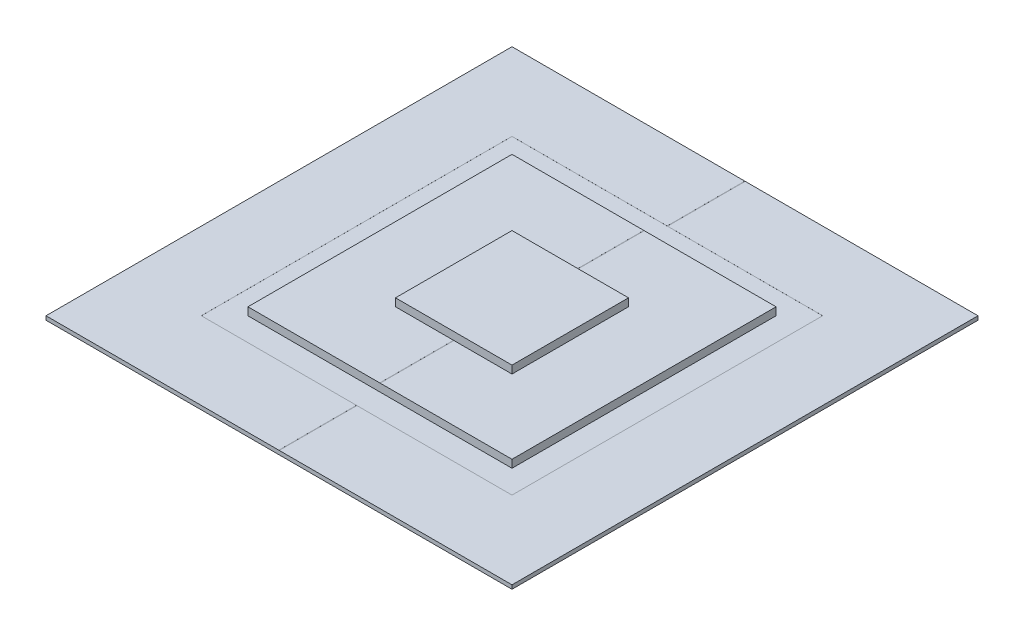
ISO-10303-21;
HEADER;
FILE_DESCRIPTION(('STEP AP214'),'2;1');
FILE_NAME('part.step','',(''),(''),'','','');
FILE_SCHEMA(('AUTOMOTIVE_DESIGN { 1 0 10303 214 1 1 1 1 }'));
ENDSEC;
DATA;
#1=APPLICATION_CONTEXT('core data for automotive mechanical design processes');
#2=APPLICATION_PROTOCOL_DEFINITION('international standard','automotive_design',2000,#1);
#3=PRODUCT_CONTEXT('',#1,'mechanical');
#4=PRODUCT('Part','Part','',(#3));
#5=PRODUCT_RELATED_PRODUCT_CATEGORY('part','',(#4));
#6=PRODUCT_DEFINITION_FORMATION('','',#4);
#7=PRODUCT_DEFINITION_CONTEXT('part definition',#1,'design');
#8=PRODUCT_DEFINITION('design','',#6,#7);
#9=PRODUCT_DEFINITION_SHAPE('','',#8);
#10=(LENGTH_UNIT() NAMED_UNIT(*) SI_UNIT(.MILLI.,.METRE.));
#11=(NAMED_UNIT(*) PLANE_ANGLE_UNIT() SI_UNIT($,.RADIAN.));
#12=(NAMED_UNIT(*) SI_UNIT($,.STERADIAN.) SOLID_ANGLE_UNIT());
#13=UNCERTAINTY_MEASURE_WITH_UNIT(LENGTH_MEASURE(1.E-05),#10,'distance_accuracy_value','');
#14=(GEOMETRIC_REPRESENTATION_CONTEXT(3) GLOBAL_UNCERTAINTY_ASSIGNED_CONTEXT((#13)) GLOBAL_UNIT_ASSIGNED_CONTEXT((#10,
#11,#12)) REPRESENTATION_CONTEXT('',''));
#15=CARTESIAN_POINT('',(0.,0.,0.));
#16=DIRECTION('',(0.,0.,1.));
#17=DIRECTION('',(1.,0.,0.));
#18=AXIS2_PLACEMENT_3D('',#15,#16,#17);
#19=CARTESIAN_POINT('',(0.,300.,0.));
#20=DIRECTION('',(0.,1.,0.));
#21=DIRECTION('',(0.,0.,1.));
#22=AXIS2_PLACEMENT_3D('',#19,#20,#21);
#23=PLANE('',#22);
#24=DIRECTION('',(0.,0.,1.));
#25=VECTOR('',#24,1.);
#26=CARTESIAN_POINT('',(4500.,300.,4500.));
#27=LINE('',#26,#25);
#28=CARTESIAN_POINT('',(4500.,300.,4500.));
#29=VERTEX_POINT('',#28);
#30=CARTESIAN_POINT('',(4500.,300.,7500.));
#31=VERTEX_POINT('',#30);
#32=EDGE_CURVE('E940',#29,#31,#27,.T.);
#33=ORIENTED_EDGE('',*,*,#32,.F.);
#34=DIRECTION('',(-1.,0.,0.));
#35=VECTOR('',#34,1.);
#36=CARTESIAN_POINT('',(7500.,300.,4500.));
#37=LINE('',#36,#35);
#38=CARTESIAN_POINT('',(5995.,300.,4500.));
#39=VERTEX_POINT('',#38);
#40=EDGE_CURVE('E291',#39,#29,#37,.T.);
#41=ORIENTED_EDGE('',*,*,#40,.F.);
#42=DIRECTION('',(0.,0.,-1.));
#43=VECTOR('',#42,1.);
#44=CARTESIAN_POINT('',(5995.,300.,2600.));
#45=LINE('',#44,#43);
#46=CARTESIAN_POINT('',(5995.,300.,2600.));
#47=VERTEX_POINT('',#46);
#48=EDGE_CURVE('E337',#39,#47,#45,.T.);
#49=ORIENTED_EDGE('',*,*,#48,.T.);
#50=DIRECTION('',(-1.,0.,0.));
#51=VECTOR('',#50,1.);
#52=CARTESIAN_POINT('',(2600.,300.,2600.));
#53=LINE('',#52,#51);
#54=CARTESIAN_POINT('',(2600.,300.,2600.));
#55=VERTEX_POINT('',#54);
#56=EDGE_CURVE('E342',#47,#55,#53,.T.);
#57=ORIENTED_EDGE('',*,*,#56,.T.);
#58=DIRECTION('',(0.,0.,1.));
#59=VECTOR('',#58,1.);
#60=CARTESIAN_POINT('',(2600.,300.,2600.));
#61=LINE('',#60,#59);
#62=CARTESIAN_POINT('',(2600.,300.,9400.));
#63=VERTEX_POINT('',#62);
#64=EDGE_CURVE('E329',#55,#63,#61,.T.);
#65=ORIENTED_EDGE('',*,*,#64,.T.);
#66=DIRECTION('',(1.,0.,0.));
#67=VECTOR('',#66,1.);
#68=CARTESIAN_POINT('',(2600.,300.,9400.));
#69=LINE('',#68,#67);
#70=CARTESIAN_POINT('',(5995.,300.,9400.));
#71=VERTEX_POINT('',#70);
#72=EDGE_CURVE('E333',#63,#71,#69,.T.);
#73=ORIENTED_EDGE('',*,*,#72,.T.);
#74=CARTESIAN_POINT('',(5995.,300.,7500.));
#75=VERTEX_POINT('',#74);
#76=EDGE_CURVE('E338',#71,#75,#45,.T.);
#77=ORIENTED_EDGE('',*,*,#76,.T.);
#78=DIRECTION('',(1.,0.,0.));
#79=VECTOR('',#78,1.);
#80=CARTESIAN_POINT('',(4500.,300.,7500.));
#81=LINE('',#80,#79);
#82=EDGE_CURVE('E933',#31,#75,#81,.T.);
#83=ORIENTED_EDGE('',*,*,#82,.F.);
#84=EDGE_LOOP('',(#33,#41,#49,#57,#65,#73,#77,#83));
#85=FACE_BOUND('',#84,.T.);
#86=ADVANCED_FACE('F67',(#85),#23,.T.);
#87=CARTESIAN_POINT('',(0.,300.,0.));
#88=DIRECTION('',(0.,1.,0.));
#89=DIRECTION('',(0.,0.,1.));
#90=AXIS2_PLACEMENT_3D('',#87,#88,#89);
#91=PLANE('',#90);
#92=DIRECTION('',(0.,0.,1.));
#93=VECTOR('',#92,1.);
#94=CARTESIAN_POINT('',(6005.,300.,2600.));
#95=LINE('',#94,#93);
#96=CARTESIAN_POINT('',(6005.,300.,2600.));
#97=VERTEX_POINT('',#96);
#98=CARTESIAN_POINT('',(6005.,300.,4500.));
#99=VERTEX_POINT('',#98);
#100=EDGE_CURVE('E312',#97,#99,#95,.T.);
#101=ORIENTED_EDGE('',*,*,#100,.T.);
#102=CARTESIAN_POINT('',(7500.,300.,4500.));
#103=VERTEX_POINT('',#102);
#104=EDGE_CURVE('E935',#103,#99,#37,.T.);
#105=ORIENTED_EDGE('',*,*,#104,.F.);
#106=DIRECTION('',(0.,0.,-1.));
#107=VECTOR('',#106,1.);
#108=CARTESIAN_POINT('',(7500.,300.,7500.));
#109=LINE('',#108,#107);
#110=CARTESIAN_POINT('',(7500.,300.,7500.));
#111=VERTEX_POINT('',#110);
#112=EDGE_CURVE('E285',#111,#103,#109,.T.);
#113=ORIENTED_EDGE('',*,*,#112,.F.);
#114=DIRECTION('',(-1.,0.,0.));
#115=VECTOR('',#114,1.);
#116=CARTESIAN_POINT('',(0.,300.,7500.));
#117=LINE('',#116,#115);
#118=CARTESIAN_POINT('',(6005.,300.,7500.));
#119=VERTEX_POINT('',#118);
#120=EDGE_CURVE('E12',#111,#119,#117,.T.);
#121=ORIENTED_EDGE('',*,*,#120,.T.);
#122=CARTESIAN_POINT('',(6005.,300.,9400.));
#123=VERTEX_POINT('',#122);
#124=EDGE_CURVE('E311',#119,#123,#95,.T.);
#125=ORIENTED_EDGE('',*,*,#124,.T.);
#126=DIRECTION('',(1.,0.,0.));
#127=VECTOR('',#126,1.);
#128=CARTESIAN_POINT('',(6005.,300.,9400.));
#129=LINE('',#128,#127);
#130=CARTESIAN_POINT('',(9400.,300.,9400.));
#131=VERTEX_POINT('',#130);
#132=EDGE_CURVE('E316',#123,#131,#129,.T.);
#133=ORIENTED_EDGE('',*,*,#132,.T.);
#134=DIRECTION('',(0.,0.,-1.));
#135=VECTOR('',#134,1.);
#136=CARTESIAN_POINT('',(9400.,300.,2600.));
#137=LINE('',#136,#135);
#138=CARTESIAN_POINT('',(9400.,300.,2600.));
#139=VERTEX_POINT('',#138);
#140=EDGE_CURVE('E321',#131,#139,#137,.T.);
#141=ORIENTED_EDGE('',*,*,#140,.T.);
#142=DIRECTION('',(-1.,0.,0.));
#143=VECTOR('',#142,1.);
#144=CARTESIAN_POINT('',(6005.,300.,2600.));
#145=LINE('',#144,#143);
#146=EDGE_CURVE('E325',#139,#97,#145,.T.);
#147=ORIENTED_EDGE('',*,*,#146,.T.);
#148=EDGE_LOOP('',(#101,#105,#113,#121,#125,#133,#141,#147));
#149=FACE_BOUND('',#148,.T.);
#150=ADVANCED_FACE('F574',(#149),#91,.T.);
#151=CARTESIAN_POINT('',(6005.,99.5,0.));
#152=DIRECTION('',(1.,0.,0.));
#153=DIRECTION('',(0.,0.,-1.));
#154=AXIS2_PLACEMENT_3D('',#151,#152,#153);
#155=PLANE('',#154);
#156=DIRECTION('',(0.,0.,-1.));
#157=VECTOR('',#156,1.);
#158=CARTESIAN_POINT('',(6005.,299.5,2600.));
#159=LINE('',#158,#157);
#160=CARTESIAN_POINT('',(6005.,299.5,9400.));
#161=VERTEX_POINT('',#160);
#162=CARTESIAN_POINT('',(6005.,299.5,2600.));
#163=VERTEX_POINT('',#162);
#164=EDGE_CURVE('E305',#161,#163,#159,.T.);
#165=ORIENTED_EDGE('',*,*,#164,.F.);
#166=DIRECTION('',(0.,-1.,0.));
#167=VECTOR('',#166,1.);
#168=CARTESIAN_POINT('',(6005.,100.,9400.));
#169=LINE('',#168,#167);
#170=EDGE_CURVE('E399',#123,#161,#169,.T.);
#171=ORIENTED_EDGE('',*,*,#170,.F.);
#172=ORIENTED_EDGE('',*,*,#124,.F.);
#173=EDGE_CURVE('E317',#99,#119,#95,.T.);
#174=ORIENTED_EDGE('',*,*,#173,.F.);
#175=ORIENTED_EDGE('',*,*,#100,.F.);
#176=DIRECTION('',(0.,1.,0.));
#177=VECTOR('',#176,1.);
#178=CARTESIAN_POINT('',(6005.,100.,2600.));
#179=LINE('',#178,#177);
#180=EDGE_CURVE('E403',#163,#97,#179,.T.);
#181=ORIENTED_EDGE('',*,*,#180,.F.);
#182=EDGE_LOOP('',(#165,#171,#172,#174,#175,#181));
#183=FACE_BOUND('',#182,.T.);
#184=ADVANCED_FACE('F581',(#183),#155,.F.);
#185=CARTESIAN_POINT('',(5995.,99.5,0.));
#186=DIRECTION('',(-1.,0.,0.));
#187=DIRECTION('',(0.,0.,1.));
#188=AXIS2_PLACEMENT_3D('',#185,#186,#187);
#189=PLANE('',#188);
#190=DIRECTION('',(0.,0.,1.));
#191=VECTOR('',#190,1.);
#192=CARTESIAN_POINT('',(5995.,299.5,9400.));
#193=LINE('',#192,#191);
#194=CARTESIAN_POINT('',(5995.,299.5,2600.));
#195=VERTEX_POINT('',#194);
#196=CARTESIAN_POINT('',(5995.,299.5,9400.));
#197=VERTEX_POINT('',#196);
#198=EDGE_CURVE('E293',#195,#197,#193,.T.);
#199=ORIENTED_EDGE('',*,*,#198,.F.);
#200=DIRECTION('',(0.,-1.,0.));
#201=VECTOR('',#200,1.);
#202=CARTESIAN_POINT('',(5995.,100.,2600.));
#203=LINE('',#202,#201);
#204=EDGE_CURVE('E389',#47,#195,#203,.T.);
#205=ORIENTED_EDGE('',*,*,#204,.F.);
#206=ORIENTED_EDGE('',*,*,#48,.F.);
#207=EDGE_CURVE('E343',#75,#39,#45,.T.);
#208=ORIENTED_EDGE('',*,*,#207,.F.);
#209=ORIENTED_EDGE('',*,*,#76,.F.);
#210=DIRECTION('',(0.,1.,0.));
#211=VECTOR('',#210,1.);
#212=CARTESIAN_POINT('',(5995.,100.,9400.));
#213=LINE('',#212,#211);
#214=EDGE_CURVE('E377',#197,#71,#213,.T.);
#215=ORIENTED_EDGE('',*,*,#214,.F.);
#216=EDGE_LOOP('',(#199,#205,#206,#208,#209,#215));
#217=FACE_BOUND('',#216,.T.);
#218=ADVANCED_FACE('F604',(#217),#189,.F.);
#219=CARTESIAN_POINT('',(0.,100.,0.));
#220=DIRECTION('',(0.,1.,0.));
#221=DIRECTION('',(0.,0.,1.));
#222=AXIS2_PLACEMENT_3D('',#219,#220,#221);
#223=PLANE('',#222);
#224=DIRECTION('',(0.,0.,-1.));
#225=VECTOR('',#224,1.);
#226=CARTESIAN_POINT('',(6005.,100.,0.));
#227=LINE('',#226,#225);
#228=CARTESIAN_POINT('',(6005.,100.,12000.));
#229=VERTEX_POINT('',#228);
#230=CARTESIAN_POINT('',(6005.,100.,10000.));
#231=VERTEX_POINT('',#230);
#232=EDGE_CURVE('E353',#229,#231,#227,.T.);
#233=ORIENTED_EDGE('',*,*,#232,.F.);
#234=DIRECTION('',(1.,0.,0.));
#235=VECTOR('',#234,1.);
#236=CARTESIAN_POINT('',(0.,100.,12000.));
#237=LINE('',#236,#235);
#238=CARTESIAN_POINT('',(12000.,100.,12000.));
#239=VERTEX_POINT('',#238);
#240=EDGE_CURVE('E494',#229,#239,#237,.T.);
#241=ORIENTED_EDGE('',*,*,#240,.T.);
#242=DIRECTION('',(0.,0.,-1.));
#243=VECTOR('',#242,1.);
#244=CARTESIAN_POINT('',(12000.,100.,0.));
#245=LINE('',#244,#243);
#246=CARTESIAN_POINT('',(12000.,100.,0.));
#247=VERTEX_POINT('',#246);
#248=EDGE_CURVE('E482',#239,#247,#245,.T.);
#249=ORIENTED_EDGE('',*,*,#248,.T.);
#250=DIRECTION('',(-1.,0.,0.));
#251=VECTOR('',#250,1.);
#252=CARTESIAN_POINT('',(0.,100.,0.));
#253=LINE('',#252,#251);
#254=CARTESIAN_POINT('',(6005.,100.,0.));
#255=VERTEX_POINT('',#254);
#256=EDGE_CURVE('E487',#247,#255,#253,.T.);
#257=ORIENTED_EDGE('',*,*,#256,.T.);
#258=CARTESIAN_POINT('',(6005.,100.,2000.));
#259=VERTEX_POINT('',#258);
#260=EDGE_CURVE('E370',#259,#255,#227,.T.);
#261=ORIENTED_EDGE('',*,*,#260,.F.);
#262=DIRECTION('',(-1.,0.,0.));
#263=VECTOR('',#262,1.);
#264=CARTESIAN_POINT('',(0.,100.,2000.));
#265=LINE('',#264,#263);
#266=CARTESIAN_POINT('',(10000.,100.,2000.));
#267=VERTEX_POINT('',#266);
#268=EDGE_CURVE('E478',#267,#259,#265,.T.);
#269=ORIENTED_EDGE('',*,*,#268,.F.);
#270=DIRECTION('',(0.,0.,-1.));
#271=VECTOR('',#270,1.);
#272=CARTESIAN_POINT('',(10000.,100.,0.));
#273=LINE('',#272,#271);
#274=CARTESIAN_POINT('',(10000.,100.,10000.));
#275=VERTEX_POINT('',#274);
#276=EDGE_CURVE('E463',#275,#267,#273,.T.);
#277=ORIENTED_EDGE('',*,*,#276,.F.);
#278=DIRECTION('',(1.,0.,0.));
#279=VECTOR('',#278,1.);
#280=CARTESIAN_POINT('',(0.,100.,10000.));
#281=LINE('',#280,#279);
#282=EDGE_CURVE('E467',#231,#275,#281,.T.);
#283=ORIENTED_EDGE('',*,*,#282,.F.);
#284=EDGE_LOOP('',(#233,#241,#249,#257,#261,#269,#277,#283));
#285=FACE_BOUND('',#284,.T.);
#286=ADVANCED_FACE('F655',(#285),#223,.T.);
#287=CARTESIAN_POINT('',(12000.,100.,0.));
#288=DIRECTION('',(-1.,0.,0.));
#289=DIRECTION('',(0.,0.,1.));
#290=AXIS2_PLACEMENT_3D('',#287,#288,#289);
#291=PLANE('',#290);
#292=DIRECTION('',(0.,0.,-1.));
#293=VECTOR('',#292,1.);
#294=CARTESIAN_POINT('',(12000.,0.,0.));
#295=LINE('',#294,#293);
#296=CARTESIAN_POINT('',(12000.,0.,12000.));
#297=VERTEX_POINT('',#296);
#298=CARTESIAN_POINT('',(12000.,0.,0.));
#299=VERTEX_POINT('',#298);
#300=EDGE_CURVE('E462',#297,#299,#295,.T.);
#301=ORIENTED_EDGE('',*,*,#300,.T.);
#302=DIRECTION('',(0.,-1.,0.));
#303=VECTOR('',#302,1.);
#304=CARTESIAN_POINT('',(12000.,100.,0.));
#305=LINE('',#304,#303);
#306=EDGE_CURVE('E76',#247,#299,#305,.T.);
#307=ORIENTED_EDGE('',*,*,#306,.F.);
#308=ORIENTED_EDGE('',*,*,#248,.F.);
#309=DIRECTION('',(0.,-1.,0.));
#310=VECTOR('',#309,1.);
#311=CARTESIAN_POINT('',(12000.,100.,12000.));
#312=LINE('',#311,#310);
#313=EDGE_CURVE('E511',#239,#297,#312,.T.);
#314=ORIENTED_EDGE('',*,*,#313,.T.);
#315=EDGE_LOOP('',(#301,#307,#308,#314));
#316=FACE_BOUND('',#315,.T.);
#317=ADVANCED_FACE('F670',(#316),#291,.F.);
#318=CARTESIAN_POINT('',(0.,100.,0.));
#319=DIRECTION('',(0.,0.,1.));
#320=DIRECTION('',(1.,0.,0.));
#321=AXIS2_PLACEMENT_3D('',#318,#319,#320);
#322=PLANE('',#321);
#323=DIRECTION('',(-1.,0.,0.));
#324=VECTOR('',#323,1.);
#325=CARTESIAN_POINT('',(5995.,99.5,0.));
#326=LINE('',#325,#324);
#327=CARTESIAN_POINT('',(6005.,99.5,0.));
#328=VERTEX_POINT('',#327);
#329=CARTESIAN_POINT('',(5995.,99.5,0.));
#330=VERTEX_POINT('',#329);
#331=EDGE_CURVE('E348',#328,#330,#326,.T.);
#332=ORIENTED_EDGE('',*,*,#331,.F.);
#333=DIRECTION('',(0.,1.,0.));
#334=VECTOR('',#333,1.);
#335=CARTESIAN_POINT('',(6005.,99.5,0.));
#336=LINE('',#335,#334);
#337=EDGE_CURVE('E373',#328,#255,#336,.T.);
#338=ORIENTED_EDGE('',*,*,#337,.T.);
#339=ORIENTED_EDGE('',*,*,#256,.F.);
#340=ORIENTED_EDGE('',*,*,#306,.T.);
#341=DIRECTION('',(-1.,0.,0.));
#342=VECTOR('',#341,1.);
#343=CARTESIAN_POINT('',(0.,0.,0.));
#344=LINE('',#343,#342);
#345=CARTESIAN_POINT('',(0.,0.,0.));
#346=VERTEX_POINT('',#345);
#347=EDGE_CURVE('E503',#299,#346,#344,.T.);
#348=ORIENTED_EDGE('',*,*,#347,.T.);
#349=DIRECTION('',(0.,-1.,0.));
#350=VECTOR('',#349,1.);
#351=CARTESIAN_POINT('',(0.,100.,0.));
#352=LINE('',#351,#350);
#353=CARTESIAN_POINT('',(0.,100.,0.));
#354=VERTEX_POINT('',#353);
#355=EDGE_CURVE('E520',#354,#346,#352,.T.);
#356=ORIENTED_EDGE('',*,*,#355,.F.);
#357=CARTESIAN_POINT('',(5995.,100.,0.));
#358=VERTEX_POINT('',#357);
#359=EDGE_CURVE('E486',#358,#354,#253,.T.);
#360=ORIENTED_EDGE('',*,*,#359,.F.);
#361=DIRECTION('',(0.,1.,0.));
#362=VECTOR('',#361,1.);
#363=CARTESIAN_POINT('',(5995.,99.5,0.));
#364=LINE('',#363,#362);
#365=EDGE_CURVE('E366',#330,#358,#364,.T.);
#366=ORIENTED_EDGE('',*,*,#365,.F.);
#367=EDGE_LOOP('',(#332,#338,#339,#340,#348,#356,#360,#366));
#368=FACE_BOUND('',#367,.T.);
#369=ADVANCED_FACE('F666',(#368),#322,.F.);
#370=CARTESIAN_POINT('',(0.,100.,0.));
#371=DIRECTION('',(1.,0.,0.));
#372=DIRECTION('',(0.,0.,-1.));
#373=AXIS2_PLACEMENT_3D('',#370,#371,#372);
#374=PLANE('',#373);
#375=DIRECTION('',(0.,0.,1.));
#376=VECTOR('',#375,1.);
#377=CARTESIAN_POINT('',(0.,0.,0.));
#378=LINE('',#377,#376);
#379=CARTESIAN_POINT('',(0.,0.,12000.));
#380=VERTEX_POINT('',#379);
#381=EDGE_CURVE('E506',#346,#380,#378,.T.);
#382=ORIENTED_EDGE('',*,*,#381,.T.);
#383=DIRECTION('',(0.,-1.,0.));
#384=VECTOR('',#383,1.);
#385=CARTESIAN_POINT('',(0.,100.,12000.));
#386=LINE('',#385,#384);
#387=CARTESIAN_POINT('',(0.,100.,12000.));
#388=VERTEX_POINT('',#387);
#389=EDGE_CURVE('E515',#388,#380,#386,.T.);
#390=ORIENTED_EDGE('',*,*,#389,.F.);
#391=DIRECTION('',(0.,0.,1.));
#392=VECTOR('',#391,1.);
#393=CARTESIAN_POINT('',(0.,100.,0.));
#394=LINE('',#393,#392);
#395=EDGE_CURVE('E491',#354,#388,#394,.T.);
#396=ORIENTED_EDGE('',*,*,#395,.F.);
#397=ORIENTED_EDGE('',*,*,#355,.T.);
#398=EDGE_LOOP('',(#382,#390,#396,#397));
#399=FACE_BOUND('',#398,.T.);
#400=ADVANCED_FACE('F663',(#399),#374,.F.);
#401=CARTESIAN_POINT('',(10000.,100.,0.));
#402=DIRECTION('',(-1.,0.,0.));
#403=DIRECTION('',(0.,0.,1.));
#404=AXIS2_PLACEMENT_3D('',#401,#402,#403);
#405=PLANE('',#404);
#406=DIRECTION('',(0.,0.,1.));
#407=VECTOR('',#406,1.);
#408=CARTESIAN_POINT('',(10000.,99.,10000.));
#409=LINE('',#408,#407);
#410=CARTESIAN_POINT('',(10000.,99.,2000.));
#411=VERTEX_POINT('',#410);
#412=CARTESIAN_POINT('',(10000.,99.,10000.));
#413=VERTEX_POINT('',#412);
#414=EDGE_CURVE('E449',#411,#413,#409,.T.);
#415=ORIENTED_EDGE('',*,*,#414,.T.);
#416=DIRECTION('',(0.,-1.,0.));
#417=VECTOR('',#416,1.);
#418=CARTESIAN_POINT('',(10000.,100.,10000.));
#419=LINE('',#418,#417);
#420=EDGE_CURVE('E516',#275,#413,#419,.T.);
#421=ORIENTED_EDGE('',*,*,#420,.F.);
#422=ORIENTED_EDGE('',*,*,#276,.T.);
#423=DIRECTION('',(0.,-1.,0.));
#424=VECTOR('',#423,1.);
#425=CARTESIAN_POINT('',(10000.,100.,2000.));
#426=LINE('',#425,#424);
#427=EDGE_CURVE('E499',#267,#411,#426,.T.);
#428=ORIENTED_EDGE('',*,*,#427,.T.);
#429=EDGE_LOOP('',(#415,#421,#422,#428));
#430=FACE_BOUND('',#429,.T.);
#431=ADVANCED_FACE('F69',(#430),#405,.T.);
#432=CARTESIAN_POINT('',(0.,100.,10000.));
#433=DIRECTION('',(0.,0.,-1.));
#434=DIRECTION('',(-1.,0.,0.));
#435=AXIS2_PLACEMENT_3D('',#432,#433,#434);
#436=PLANE('',#435);
#437=DIRECTION('',(0.,-1.,0.));
#438=VECTOR('',#437,1.);
#439=CARTESIAN_POINT('',(6005.,100.,10000.));
#440=LINE('',#439,#438);
#441=CARTESIAN_POINT('',(6005.,99.5,10000.));
#442=VERTEX_POINT('',#441);
#443=EDGE_CURVE('E409',#231,#442,#440,.T.);
#444=ORIENTED_EDGE('',*,*,#443,.F.);
#445=ORIENTED_EDGE('',*,*,#282,.T.);
#446=ORIENTED_EDGE('',*,*,#420,.T.);
#447=DIRECTION('',(-1.,0.,0.));
#448=VECTOR('',#447,1.);
#449=CARTESIAN_POINT('',(10000.,99.,10000.));
#450=LINE('',#449,#448);
#451=CARTESIAN_POINT('',(2000.,99.,10000.));
#452=VERTEX_POINT('',#451);
#453=EDGE_CURVE('E452',#413,#452,#450,.T.);
#454=ORIENTED_EDGE('',*,*,#453,.T.);
#455=DIRECTION('',(0.,-1.,0.));
#456=VECTOR('',#455,1.);
#457=CARTESIAN_POINT('',(2000.,100.,10000.));
#458=LINE('',#457,#456);
#459=CARTESIAN_POINT('',(2000.,100.,10000.));
#460=VERTEX_POINT('',#459);
#461=EDGE_CURVE('E533',#460,#452,#458,.T.);
#462=ORIENTED_EDGE('',*,*,#461,.F.);
#463=CARTESIAN_POINT('',(5995.,100.,10000.));
#464=VERTEX_POINT('',#463);
#465=EDGE_CURVE('E469',#460,#464,#281,.T.);
#466=ORIENTED_EDGE('',*,*,#465,.T.);
#467=DIRECTION('',(0.,1.,0.));
#468=VECTOR('',#467,1.);
#469=CARTESIAN_POINT('',(5995.,100.,10000.));
#470=LINE('',#469,#468);
#471=CARTESIAN_POINT('',(5995.,99.5,10000.));
#472=VERTEX_POINT('',#471);
#473=EDGE_CURVE('E396',#472,#464,#470,.T.);
#474=ORIENTED_EDGE('',*,*,#473,.F.);
#475=DIRECTION('',(-1.,0.,0.));
#476=VECTOR('',#475,1.);
#477=CARTESIAN_POINT('',(0.,99.5,10000.));
#478=LINE('',#477,#476);
#479=EDGE_CURVE('E415',#442,#472,#478,.T.);
#480=ORIENTED_EDGE('',*,*,#479,.F.);
#481=EDGE_LOOP('',(#444,#445,#446,#454,#462,#466,#474,#480));
#482=FACE_BOUND('',#481,.T.);
#483=ADVANCED_FACE('F542',(#482),#436,.T.);
#484=CARTESIAN_POINT('',(2000.,100.,0.));
#485=DIRECTION('',(1.,0.,0.));
#486=DIRECTION('',(0.,0.,-1.));
#487=AXIS2_PLACEMENT_3D('',#484,#485,#486);
#488=PLANE('',#487);
#489=DIRECTION('',(0.,0.,-1.));
#490=VECTOR('',#489,1.);
#491=CARTESIAN_POINT('',(2000.,99.,10000.));
#492=LINE('',#491,#490);
#493=CARTESIAN_POINT('',(2000.,99.,2000.));
#494=VERTEX_POINT('',#493);
#495=EDGE_CURVE('E455',#452,#494,#492,.T.);
#496=ORIENTED_EDGE('',*,*,#495,.T.);
#497=DIRECTION('',(0.,-1.,0.));
#498=VECTOR('',#497,1.);
#499=CARTESIAN_POINT('',(2000.,100.,2000.));
#500=LINE('',#499,#498);
#501=CARTESIAN_POINT('',(2000.,100.,2000.));
#502=VERTEX_POINT('',#501);
#503=EDGE_CURVE('E530',#502,#494,#500,.T.);
#504=ORIENTED_EDGE('',*,*,#503,.F.);
#505=DIRECTION('',(0.,0.,1.));
#506=VECTOR('',#505,1.);
#507=CARTESIAN_POINT('',(2000.,100.,0.));
#508=LINE('',#507,#506);
#509=EDGE_CURVE('E473',#502,#460,#508,.T.);
#510=ORIENTED_EDGE('',*,*,#509,.T.);
#511=ORIENTED_EDGE('',*,*,#461,.T.);
#512=EDGE_LOOP('',(#496,#504,#510,#511));
#513=FACE_BOUND('',#512,.T.);
#514=ADVANCED_FACE('F553',(#513),#488,.T.);
#515=CARTESIAN_POINT('',(0.,100.,2000.));
#516=DIRECTION('',(0.,0.,1.));
#517=DIRECTION('',(1.,0.,0.));
#518=AXIS2_PLACEMENT_3D('',#515,#516,#517);
#519=PLANE('',#518);
#520=DIRECTION('',(0.,1.,0.));
#521=VECTOR('',#520,1.);
#522=CARTESIAN_POINT('',(6005.,100.,2000.));
#523=LINE('',#522,#521);
#524=CARTESIAN_POINT('',(6005.,99.5,2000.));
#525=VERTEX_POINT('',#524);
#526=EDGE_CURVE('E406',#525,#259,#523,.T.);
#527=ORIENTED_EDGE('',*,*,#526,.F.);
#528=DIRECTION('',(1.,0.,0.));
#529=VECTOR('',#528,1.);
#530=CARTESIAN_POINT('',(0.,99.5,2000.));
#531=LINE('',#530,#529);
#532=CARTESIAN_POINT('',(5995.,99.5,2000.));
#533=VERTEX_POINT('',#532);
#534=EDGE_CURVE('E412',#533,#525,#531,.T.);
#535=ORIENTED_EDGE('',*,*,#534,.F.);
#536=DIRECTION('',(0.,-1.,0.));
#537=VECTOR('',#536,1.);
#538=CARTESIAN_POINT('',(5995.,100.,2000.));
#539=LINE('',#538,#537);
#540=CARTESIAN_POINT('',(5995.,100.,2000.));
#541=VERTEX_POINT('',#540);
#542=EDGE_CURVE('E393',#541,#533,#539,.T.);
#543=ORIENTED_EDGE('',*,*,#542,.F.);
#544=EDGE_CURVE('E477',#541,#502,#265,.T.);
#545=ORIENTED_EDGE('',*,*,#544,.T.);
#546=ORIENTED_EDGE('',*,*,#503,.T.);
#547=DIRECTION('',(1.,0.,0.));
#548=VECTOR('',#547,1.);
#549=CARTESIAN_POINT('',(10000.,99.,2000.));
#550=LINE('',#549,#548);
#551=EDGE_CURVE('E459',#494,#411,#550,.T.);
#552=ORIENTED_EDGE('',*,*,#551,.T.);
#553=ORIENTED_EDGE('',*,*,#427,.F.);
#554=ORIENTED_EDGE('',*,*,#268,.T.);
#555=EDGE_LOOP('',(#527,#535,#543,#545,#546,#552,#553,#554));
#556=FACE_BOUND('',#555,.T.);
#557=ADVANCED_FACE('F661',(#556),#519,.T.);
#558=CARTESIAN_POINT('',(0.,100.,12000.));
#559=DIRECTION('',(0.,0.,-1.));
#560=DIRECTION('',(-1.,0.,0.));
#561=AXIS2_PLACEMENT_3D('',#558,#559,#560);
#562=PLANE('',#561);
#563=ORIENTED_EDGE('',*,*,#240,.F.);
#564=DIRECTION('',(0.,1.,0.));
#565=VECTOR('',#564,1.);
#566=CARTESIAN_POINT('',(6005.,99.5,12000.));
#567=LINE('',#566,#565);
#568=CARTESIAN_POINT('',(6005.,99.5,12000.));
#569=VERTEX_POINT('',#568);
#570=EDGE_CURVE('E378',#569,#229,#567,.T.);
#571=ORIENTED_EDGE('',*,*,#570,.F.);
#572=DIRECTION('',(1.,0.,0.));
#573=VECTOR('',#572,1.);
#574=CARTESIAN_POINT('',(5995.,99.5,12000.));
#575=LINE('',#574,#573);
#576=CARTESIAN_POINT('',(5995.,99.5,12000.));
#577=VERTEX_POINT('',#576);
#578=EDGE_CURVE('E358',#577,#569,#575,.T.);
#579=ORIENTED_EDGE('',*,*,#578,.F.);
#580=DIRECTION('',(0.,1.,0.));
#581=VECTOR('',#580,1.);
#582=CARTESIAN_POINT('',(5995.,99.5,12000.));
#583=LINE('',#582,#581);
#584=CARTESIAN_POINT('',(5995.,100.,12000.));
#585=VERTEX_POINT('',#584);
#586=EDGE_CURVE('E381',#577,#585,#583,.T.);
#587=ORIENTED_EDGE('',*,*,#586,.T.);
#588=EDGE_CURVE('E495',#388,#585,#237,.T.);
#589=ORIENTED_EDGE('',*,*,#588,.F.);
#590=ORIENTED_EDGE('',*,*,#389,.T.);
#591=DIRECTION('',(1.,0.,0.));
#592=VECTOR('',#591,1.);
#593=CARTESIAN_POINT('',(0.,0.,12000.));
#594=LINE('',#593,#592);
#595=EDGE_CURVE('E468',#380,#297,#594,.T.);
#596=ORIENTED_EDGE('',*,*,#595,.T.);
#597=ORIENTED_EDGE('',*,*,#313,.F.);
#598=EDGE_LOOP('',(#563,#571,#579,#587,#589,#590,#596,#597));
#599=FACE_BOUND('',#598,.T.);
#600=ADVANCED_FACE('F654',(#599),#562,.F.);
#601=DIRECTION('',(0.,0.,1.));
#602=VECTOR('',#601,1.);
#603=CARTESIAN_POINT('',(5995.,100.,0.));
#604=LINE('',#603,#602);
#605=EDGE_CURVE('E367',#358,#541,#604,.T.);
#606=ORIENTED_EDGE('',*,*,#605,.F.);
#607=ORIENTED_EDGE('',*,*,#359,.T.);
#608=ORIENTED_EDGE('',*,*,#395,.T.);
#609=ORIENTED_EDGE('',*,*,#588,.T.);
#610=EDGE_CURVE('E347',#464,#585,#604,.T.);
#611=ORIENTED_EDGE('',*,*,#610,.F.);
#612=ORIENTED_EDGE('',*,*,#465,.F.);
#613=ORIENTED_EDGE('',*,*,#509,.F.);
#614=ORIENTED_EDGE('',*,*,#544,.F.);
#615=EDGE_LOOP('',(#606,#607,#608,#609,#611,#612,#613,#614));
#616=FACE_BOUND('',#615,.T.);
#617=ADVANCED_FACE('F560',(#616),#223,.T.);
#618=CARTESIAN_POINT('',(0.,0.,0.));
#619=DIRECTION('',(0.,1.,0.));
#620=DIRECTION('',(0.,0.,1.));
#621=AXIS2_PLACEMENT_3D('',#618,#619,#620);
#622=PLANE('',#621);
#623=ORIENTED_EDGE('',*,*,#300,.F.);
#624=ORIENTED_EDGE('',*,*,#595,.F.);
#625=ORIENTED_EDGE('',*,*,#381,.F.);
#626=ORIENTED_EDGE('',*,*,#347,.F.);
#627=EDGE_LOOP('',(#623,#624,#625,#626));
#628=FACE_BOUND('',#627,.T.);
#629=ADVANCED_FACE('F651',(#628),#622,.F.);
#630=CARTESIAN_POINT('',(0.,99.,0.));
#631=DIRECTION('',(0.,1.,0.));
#632=DIRECTION('',(0.,0.,1.));
#633=AXIS2_PLACEMENT_3D('',#630,#631,#632);
#634=PLANE('',#633);
#635=DIRECTION('',(0.,0.,-1.));
#636=VECTOR('',#635,1.);
#637=CARTESIAN_POINT('',(2600.,99.,2600.));
#638=LINE('',#637,#636);
#639=CARTESIAN_POINT('',(2600.,99.,9400.));
#640=VERTEX_POINT('',#639);
#641=CARTESIAN_POINT('',(2600.,99.,2600.));
#642=VERTEX_POINT('',#641);
#643=EDGE_CURVE('E433',#640,#642,#638,.T.);
#644=ORIENTED_EDGE('',*,*,#643,.T.);
#645=DIRECTION('',(1.,0.,0.));
#646=VECTOR('',#645,1.);
#647=CARTESIAN_POINT('',(2600.,99.,2600.));
#648=LINE('',#647,#646);
#649=CARTESIAN_POINT('',(9400.,99.,2600.));
#650=VERTEX_POINT('',#649);
#651=EDGE_CURVE('E437',#642,#650,#648,.T.);
#652=ORIENTED_EDGE('',*,*,#651,.T.);
#653=DIRECTION('',(0.,0.,1.));
#654=VECTOR('',#653,1.);
#655=CARTESIAN_POINT('',(9400.,99.,2600.));
#656=LINE('',#655,#654);
#657=CARTESIAN_POINT('',(9400.,99.,9400.));
#658=VERTEX_POINT('',#657);
#659=EDGE_CURVE('E441',#650,#658,#656,.T.);
#660=ORIENTED_EDGE('',*,*,#659,.T.);
#661=DIRECTION('',(-1.,0.,0.));
#662=VECTOR('',#661,1.);
#663=CARTESIAN_POINT('',(2600.,99.,9400.));
#664=LINE('',#663,#662);
#665=EDGE_CURVE('E445',#658,#640,#664,.T.);
#666=ORIENTED_EDGE('',*,*,#665,.T.);
#667=EDGE_LOOP('',(#644,#652,#660,#666));
#668=FACE_BOUND('',#667,.T.);
#669=ORIENTED_EDGE('',*,*,#414,.F.);
#670=ORIENTED_EDGE('',*,*,#551,.F.);
#671=ORIENTED_EDGE('',*,*,#495,.F.);
#672=ORIENTED_EDGE('',*,*,#453,.F.);
#673=EDGE_LOOP('',(#669,#670,#671,#672));
#674=FACE_BOUND('',#673,.T.);
#675=ADVANCED_FACE('F549',(#668,#674),#634,.T.);
#676=CARTESIAN_POINT('',(9400.,100.,9400.));
#677=DIRECTION('',(-1.,0.,0.));
#678=DIRECTION('',(0.,0.,1.));
#679=AXIS2_PLACEMENT_3D('',#676,#677,#678);
#680=PLANE('',#679);
#681=ORIENTED_EDGE('',*,*,#659,.F.);
#682=DIRECTION('',(0.,-1.,0.));
#683=VECTOR('',#682,1.);
#684=CARTESIAN_POINT('',(9400.,100.,2600.));
#685=LINE('',#684,#683);
#686=EDGE_CURVE('E418',#139,#650,#685,.T.);
#687=ORIENTED_EDGE('',*,*,#686,.F.);
#688=ORIENTED_EDGE('',*,*,#140,.F.);
#689=DIRECTION('',(0.,-1.,0.));
#690=VECTOR('',#689,1.);
#691=CARTESIAN_POINT('',(9400.,100.,9400.));
#692=LINE('',#691,#690);
#693=EDGE_CURVE('E429',#131,#658,#692,.T.);
#694=ORIENTED_EDGE('',*,*,#693,.T.);
#695=EDGE_LOOP('',(#681,#687,#688,#694));
#696=FACE_BOUND('',#695,.T.);
#697=ADVANCED_FACE('F586',(#696),#680,.F.);
#698=CARTESIAN_POINT('',(9400.,100.,2600.));
#699=DIRECTION('',(0.,0.,1.));
#700=DIRECTION('',(1.,0.,0.));
#701=AXIS2_PLACEMENT_3D('',#698,#699,#700);
#702=PLANE('',#701);
#703=DIRECTION('',(-1.,0.,0.));
#704=VECTOR('',#703,1.);
#705=CARTESIAN_POINT('',(5995.,299.5,2600.));
#706=LINE('',#705,#704);
#707=EDGE_CURVE('E308',#163,#195,#706,.T.);
#708=ORIENTED_EDGE('',*,*,#707,.F.);
#709=ORIENTED_EDGE('',*,*,#180,.T.);
#710=ORIENTED_EDGE('',*,*,#146,.F.);
#711=ORIENTED_EDGE('',*,*,#686,.T.);
#712=ORIENTED_EDGE('',*,*,#651,.F.);
#713=DIRECTION('',(0.,-1.,0.));
#714=VECTOR('',#713,1.);
#715=CARTESIAN_POINT('',(2600.,100.,2600.));
#716=LINE('',#715,#714);
#717=EDGE_CURVE('E422',#55,#642,#716,.T.);
#718=ORIENTED_EDGE('',*,*,#717,.F.);
#719=ORIENTED_EDGE('',*,*,#56,.F.);
#720=ORIENTED_EDGE('',*,*,#204,.T.);
#721=EDGE_LOOP('',(#708,#709,#710,#711,#712,#718,#719,#720));
#722=FACE_BOUND('',#721,.T.);
#723=ADVANCED_FACE('F591',(#722),#702,.F.);
#724=CARTESIAN_POINT('',(2600.,100.,2600.));
#725=DIRECTION('',(1.,0.,0.));
#726=DIRECTION('',(0.,0.,-1.));
#727=AXIS2_PLACEMENT_3D('',#724,#725,#726);
#728=PLANE('',#727);
#729=ORIENTED_EDGE('',*,*,#643,.F.);
#730=DIRECTION('',(0.,-1.,0.));
#731=VECTOR('',#730,1.);
#732=CARTESIAN_POINT('',(2600.,100.,9400.));
#733=LINE('',#732,#731);
#734=EDGE_CURVE('E426',#63,#640,#733,.T.);
#735=ORIENTED_EDGE('',*,*,#734,.F.);
#736=ORIENTED_EDGE('',*,*,#64,.F.);
#737=ORIENTED_EDGE('',*,*,#717,.T.);
#738=EDGE_LOOP('',(#729,#735,#736,#737));
#739=FACE_BOUND('',#738,.T.);
#740=ADVANCED_FACE('F596',(#739),#728,.F.);
#741=CARTESIAN_POINT('',(2600.,100.,9400.));
#742=DIRECTION('',(0.,0.,-1.));
#743=DIRECTION('',(-1.,0.,0.));
#744=AXIS2_PLACEMENT_3D('',#741,#742,#743);
#745=PLANE('',#744);
#746=DIRECTION('',(1.,0.,0.));
#747=VECTOR('',#746,1.);
#748=CARTESIAN_POINT('',(6005.,299.5,9400.));
#749=LINE('',#748,#747);
#750=EDGE_CURVE('E298',#197,#161,#749,.T.);
#751=ORIENTED_EDGE('',*,*,#750,.F.);
#752=ORIENTED_EDGE('',*,*,#214,.T.);
#753=ORIENTED_EDGE('',*,*,#72,.F.);
#754=ORIENTED_EDGE('',*,*,#734,.T.);
#755=ORIENTED_EDGE('',*,*,#665,.F.);
#756=ORIENTED_EDGE('',*,*,#693,.F.);
#757=ORIENTED_EDGE('',*,*,#132,.F.);
#758=ORIENTED_EDGE('',*,*,#170,.T.);
#759=EDGE_LOOP('',(#751,#752,#753,#754,#755,#756,#757,#758));
#760=FACE_BOUND('',#759,.T.);
#761=ADVANCED_FACE('F584',(#760),#745,.F.);
#762=ORIENTED_EDGE('',*,*,#473,.T.);
#763=ORIENTED_EDGE('',*,*,#610,.T.);
#764=ORIENTED_EDGE('',*,*,#586,.F.);
#765=DIRECTION('',(0.,0.,1.));
#766=VECTOR('',#765,1.);
#767=CARTESIAN_POINT('',(5995.,99.5,0.));
#768=LINE('',#767,#766);
#769=EDGE_CURVE('E352',#472,#577,#768,.T.);
#770=ORIENTED_EDGE('',*,*,#769,.F.);
#771=EDGE_LOOP('',(#762,#763,#764,#770));
#772=FACE_BOUND('',#771,.T.);
#773=ADVANCED_FACE('F622',(#772),#189,.F.);
#774=ORIENTED_EDGE('',*,*,#443,.T.);
#775=DIRECTION('',(0.,0.,-1.));
#776=VECTOR('',#775,1.);
#777=CARTESIAN_POINT('',(6005.,99.5,0.));
#778=LINE('',#777,#776);
#779=EDGE_CURVE('E362',#569,#442,#778,.T.);
#780=ORIENTED_EDGE('',*,*,#779,.F.);
#781=ORIENTED_EDGE('',*,*,#570,.T.);
#782=ORIENTED_EDGE('',*,*,#232,.T.);
#783=EDGE_LOOP('',(#774,#780,#781,#782));
#784=FACE_BOUND('',#783,.T.);
#785=ADVANCED_FACE('F635',(#784),#155,.F.);
#786=CARTESIAN_POINT('',(0.,99.5,0.));
#787=DIRECTION('',(0.,-1.,0.));
#788=DIRECTION('',(0.,0.,-1.));
#789=AXIS2_PLACEMENT_3D('',#786,#787,#788);
#790=PLANE('',#789);
#791=ORIENTED_EDGE('',*,*,#479,.T.);
#792=ORIENTED_EDGE('',*,*,#769,.T.);
#793=ORIENTED_EDGE('',*,*,#578,.T.);
#794=ORIENTED_EDGE('',*,*,#779,.T.);
#795=EDGE_LOOP('',(#791,#792,#793,#794));
#796=FACE_BOUND('',#795,.T.);
#797=ADVANCED_FACE('F631',(#796),#790,.F.);
#798=ORIENTED_EDGE('',*,*,#534,.T.);
#799=EDGE_CURVE('E361',#525,#328,#778,.T.);
#800=ORIENTED_EDGE('',*,*,#799,.T.);
#801=ORIENTED_EDGE('',*,*,#331,.T.);
#802=EDGE_CURVE('E354',#330,#533,#768,.T.);
#803=ORIENTED_EDGE('',*,*,#802,.T.);
#804=EDGE_LOOP('',(#798,#800,#801,#803));
#805=FACE_BOUND('',#804,.T.);
#806=ADVANCED_FACE('F634',(#805),#790,.F.);
#807=ORIENTED_EDGE('',*,*,#526,.T.);
#808=ORIENTED_EDGE('',*,*,#260,.T.);
#809=ORIENTED_EDGE('',*,*,#337,.F.);
#810=ORIENTED_EDGE('',*,*,#799,.F.);
#811=EDGE_LOOP('',(#807,#808,#809,#810));
#812=FACE_BOUND('',#811,.T.);
#813=ADVANCED_FACE('F619',(#812),#155,.F.);
#814=ORIENTED_EDGE('',*,*,#542,.T.);
#815=ORIENTED_EDGE('',*,*,#802,.F.);
#816=ORIENTED_EDGE('',*,*,#365,.T.);
#817=ORIENTED_EDGE('',*,*,#605,.T.);
#818=EDGE_LOOP('',(#814,#815,#816,#817));
#819=FACE_BOUND('',#818,.T.);
#820=ADVANCED_FACE('F611',(#819),#189,.F.);
#821=CARTESIAN_POINT('',(0.,299.5,0.));
#822=DIRECTION('',(0.,-1.,0.));
#823=DIRECTION('',(0.,0.,-1.));
#824=AXIS2_PLACEMENT_3D('',#821,#822,#823);
#825=PLANE('',#824);
#826=ORIENTED_EDGE('',*,*,#198,.T.);
#827=ORIENTED_EDGE('',*,*,#750,.T.);
#828=ORIENTED_EDGE('',*,*,#164,.T.);
#829=ORIENTED_EDGE('',*,*,#707,.T.);
#830=EDGE_LOOP('',(#826,#827,#828,#829));
#831=FACE_BOUND('',#830,.T.);
#832=ADVANCED_FACE('F608',(#831),#825,.F.);
#833=CARTESIAN_POINT('',(0.,300.,0.));
#834=DIRECTION('',(0.,1.,0.));
#835=DIRECTION('',(0.,0.,1.));
#836=AXIS2_PLACEMENT_3D('',#833,#834,#835);
#837=PLANE('',#836);
#838=EDGE_CURVE('E941',#99,#39,#37,.T.);
#839=ORIENTED_EDGE('',*,*,#838,.F.);
#840=ORIENTED_EDGE('',*,*,#173,.T.);
#841=EDGE_CURVE('E945',#75,#119,#81,.T.);
#842=ORIENTED_EDGE('',*,*,#841,.F.);
#843=ORIENTED_EDGE('',*,*,#207,.T.);
#844=EDGE_LOOP('',(#839,#840,#842,#843));
#845=FACE_BOUND('',#844,.T.);
#846=ADVANCED_FACE('F610',(#845),#837,.F.);
#847=CARTESIAN_POINT('',(7500.,500.,4500.));
#848=DIRECTION('',(0.,0.,1.));
#849=DIRECTION('',(1.,0.,0.));
#850=AXIS2_PLACEMENT_3D('',#847,#848,#849);
#851=PLANE('',#850);
#852=ORIENTED_EDGE('',*,*,#104,.T.);
#853=ORIENTED_EDGE('',*,*,#838,.T.);
#854=ORIENTED_EDGE('',*,*,#40,.T.);
#855=DIRECTION('',(0.,-1.,0.));
#856=VECTOR('',#855,1.);
#857=CARTESIAN_POINT('',(4500.,500.,4500.));
#858=LINE('',#857,#856);
#859=CARTESIAN_POINT('',(4500.,500.,4500.));
#860=VERTEX_POINT('',#859);
#861=EDGE_CURVE('E271',#860,#29,#858,.T.);
#862=ORIENTED_EDGE('',*,*,#861,.F.);
#863=DIRECTION('',(-1.,0.,0.));
#864=VECTOR('',#863,1.);
#865=CARTESIAN_POINT('',(7500.,500.,4500.));
#866=LINE('',#865,#864);
#867=CARTESIAN_POINT('',(7500.,500.,4500.));
#868=VERTEX_POINT('',#867);
#869=EDGE_CURVE('E276',#868,#860,#866,.T.);
#870=ORIENTED_EDGE('',*,*,#869,.F.);
#871=DIRECTION('',(0.,-1.,0.));
#872=VECTOR('',#871,1.);
#873=CARTESIAN_POINT('',(7500.,500.,4500.));
#874=LINE('',#873,#872);
#875=EDGE_CURVE('E930',#868,#103,#874,.T.);
#876=ORIENTED_EDGE('',*,*,#875,.T.);
#877=EDGE_LOOP('',(#852,#853,#854,#862,#870,#876));
#878=FACE_BOUND('',#877,.T.);
#879=ADVANCED_FACE('F288',(#878),#851,.F.);
#880=CARTESIAN_POINT('',(4500.,500.,4500.));
#881=DIRECTION('',(1.,0.,0.));
#882=DIRECTION('',(0.,0.,-1.));
#883=AXIS2_PLACEMENT_3D('',#880,#881,#882);
#884=PLANE('',#883);
#885=ORIENTED_EDGE('',*,*,#32,.T.);
#886=DIRECTION('',(0.,-1.,0.));
#887=VECTOR('',#886,1.);
#888=CARTESIAN_POINT('',(4500.,500.,7500.));
#889=LINE('',#888,#887);
#890=CARTESIAN_POINT('',(4500.,500.,7500.));
#891=VERTEX_POINT('',#890);
#892=EDGE_CURVE('E83',#891,#31,#889,.T.);
#893=ORIENTED_EDGE('',*,*,#892,.F.);
#894=DIRECTION('',(0.,0.,1.));
#895=VECTOR('',#894,1.);
#896=CARTESIAN_POINT('',(4500.,500.,4500.));
#897=LINE('',#896,#895);
#898=EDGE_CURVE('E267',#860,#891,#897,.T.);
#899=ORIENTED_EDGE('',*,*,#898,.F.);
#900=ORIENTED_EDGE('',*,*,#861,.T.);
#901=EDGE_LOOP('',(#885,#893,#899,#900));
#902=FACE_BOUND('',#901,.T.);
#903=ADVANCED_FACE('F269',(#902),#884,.F.);
#904=CARTESIAN_POINT('',(4500.,500.,7500.));
#905=DIRECTION('',(0.,0.,-1.));
#906=DIRECTION('',(-1.,0.,0.));
#907=AXIS2_PLACEMENT_3D('',#904,#905,#906);
#908=PLANE('',#907);
#909=ORIENTED_EDGE('',*,*,#82,.T.);
#910=ORIENTED_EDGE('',*,*,#841,.T.);
#911=ORIENTED_EDGE('',*,*,#120,.F.);
#912=DIRECTION('',(0.,-1.,0.));
#913=VECTOR('',#912,1.);
#914=CARTESIAN_POINT('',(7500.,500.,7500.));
#915=LINE('',#914,#913);
#916=CARTESIAN_POINT('',(7500.,500.,7500.));
#917=VERTEX_POINT('',#916);
#918=EDGE_CURVE('E91',#917,#111,#915,.T.);
#919=ORIENTED_EDGE('',*,*,#918,.F.);
#920=DIRECTION('',(1.,0.,0.));
#921=VECTOR('',#920,1.);
#922=CARTESIAN_POINT('',(4500.,500.,7500.));
#923=LINE('',#922,#921);
#924=EDGE_CURVE('E275',#891,#917,#923,.T.);
#925=ORIENTED_EDGE('',*,*,#924,.F.);
#926=ORIENTED_EDGE('',*,*,#892,.T.);
#927=EDGE_LOOP('',(#909,#910,#911,#919,#925,#926));
#928=FACE_BOUND('',#927,.T.);
#929=ADVANCED_FACE('F895',(#928),#908,.F.);
#930=CARTESIAN_POINT('',(7500.,500.,7500.));
#931=DIRECTION('',(-1.,0.,0.));
#932=DIRECTION('',(0.,0.,1.));
#933=AXIS2_PLACEMENT_3D('',#930,#931,#932);
#934=PLANE('',#933);
#935=ORIENTED_EDGE('',*,*,#112,.T.);
#936=ORIENTED_EDGE('',*,*,#875,.F.);
#937=DIRECTION('',(0.,0.,-1.));
#938=VECTOR('',#937,1.);
#939=CARTESIAN_POINT('',(7500.,500.,7500.));
#940=LINE('',#939,#938);
#941=EDGE_CURVE('E280',#917,#868,#940,.T.);
#942=ORIENTED_EDGE('',*,*,#941,.F.);
#943=ORIENTED_EDGE('',*,*,#918,.T.);
#944=EDGE_LOOP('',(#935,#936,#942,#943));
#945=FACE_BOUND('',#944,.T.);
#946=ADVANCED_FACE('F905',(#945),#934,.F.);
#947=CARTESIAN_POINT('',(0.,500.,0.));
#948=DIRECTION('',(0.,1.,0.));
#949=DIRECTION('',(0.,0.,1.));
#950=AXIS2_PLACEMENT_3D('',#947,#948,#949);
#951=PLANE('',#950);
#952=ORIENTED_EDGE('',*,*,#869,.T.);
#953=ORIENTED_EDGE('',*,*,#898,.T.);
#954=ORIENTED_EDGE('',*,*,#924,.T.);
#955=ORIENTED_EDGE('',*,*,#941,.T.);
#956=EDGE_LOOP('',(#952,#953,#954,#955));
#957=FACE_BOUND('',#956,.T.);
#958=ADVANCED_FACE('F279',(#957),#951,.T.);
#959=CLOSED_SHELL('',(#86,#150,#184,#218,#286,#317,#369,#400,#431,#483,#514,#557,#600,#617,#629,
#675,#697,#723,#740,#761,#773,#785,#797,#806,#813,#820,#832,#846,#879,#903,#929,#946,#958));
#960=MANIFOLD_SOLID_BREP('B2',#959);
#961=ADVANCED_BREP_SHAPE_REPRESENTATION('',(#18,#960),#14);
#962=SHAPE_DEFINITION_REPRESENTATION(#9,#961);
ENDSEC;
END-ISO-10303-21;
